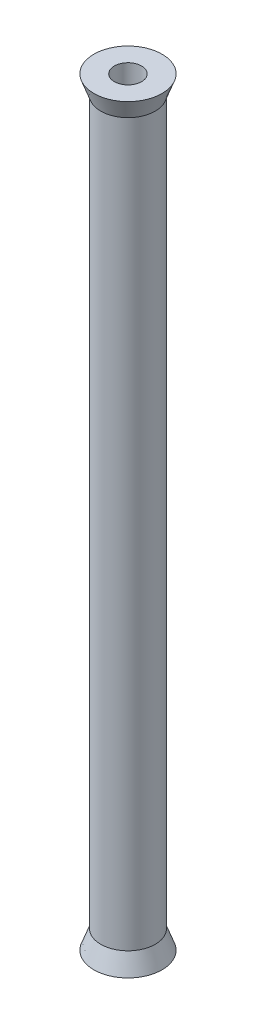
ISO-10303-21;
HEADER;
FILE_DESCRIPTION(('STEP AP214'),'2;1');
FILE_NAME('part.step','',(''),(''),'','','');
FILE_SCHEMA(('AUTOMOTIVE_DESIGN { 1 0 10303 214 1 1 1 1 }'));
ENDSEC;
DATA;
#1=APPLICATION_CONTEXT('core data for automotive mechanical design processes');
#2=APPLICATION_PROTOCOL_DEFINITION('international standard','automotive_design',2000,#1);
#3=PRODUCT_CONTEXT('',#1,'mechanical');
#4=PRODUCT('Part','Part','',(#3));
#5=PRODUCT_RELATED_PRODUCT_CATEGORY('part','',(#4));
#6=PRODUCT_DEFINITION_FORMATION('','',#4);
#7=PRODUCT_DEFINITION_CONTEXT('part definition',#1,'design');
#8=PRODUCT_DEFINITION('design','',#6,#7);
#9=PRODUCT_DEFINITION_SHAPE('','',#8);
#10=(LENGTH_UNIT() NAMED_UNIT(*) SI_UNIT(.MILLI.,.METRE.));
#11=(NAMED_UNIT(*) PLANE_ANGLE_UNIT() SI_UNIT($,.RADIAN.));
#12=(NAMED_UNIT(*) SI_UNIT($,.STERADIAN.) SOLID_ANGLE_UNIT());
#13=UNCERTAINTY_MEASURE_WITH_UNIT(LENGTH_MEASURE(1.E-05),#10,'distance_accuracy_value','');
#14=(GEOMETRIC_REPRESENTATION_CONTEXT(3) GLOBAL_UNCERTAINTY_ASSIGNED_CONTEXT((#13)) GLOBAL_UNIT_ASSIGNED_CONTEXT((#10,
#11,#12)) REPRESENTATION_CONTEXT('',''));
#15=CARTESIAN_POINT('',(0.,0.,0.));
#16=DIRECTION('',(0.,0.,1.));
#17=DIRECTION('',(1.,0.,0.));
#18=AXIS2_PLACEMENT_3D('',#15,#16,#17);
#19=CARTESIAN_POINT('',(0.,52.9525225805455,0.));
#20=DIRECTION('',(0.,1.,0.));
#21=DIRECTION('',(0.,0.,1.));
#22=AXIS2_PLACEMENT_3D('',#19,#20,#21);
#23=CONICAL_SURFACE('',#22,4.00000000000001,0.34906585039887);
#24=CARTESIAN_POINT('',(0.,55.7,0.));
#25=DIRECTION('',(0.,1.,0.));
#26=DIRECTION('',(0.,0.,1.));
#27=AXIS2_PLACEMENT_3D('',#24,#25,#26);
#28=CIRCLE('',#27,4.99999999999999);
#29=CARTESIAN_POINT('',(0.,55.7,4.99999999999999));
#30=VERTEX_POINT('',#29);
#31=EDGE_CURVE('E10',#30,#30,#28,.T.);
#32=ORIENTED_EDGE('',*,*,#31,.F.);
#33=EDGE_LOOP('',(#32));
#34=FACE_BOUND('',#33,.T.);
#35=CARTESIAN_POINT('',(0.,52.9525225805455,0.));
#36=DIRECTION('',(0.,1.,0.));
#37=DIRECTION('',(0.,0.,1.));
#38=AXIS2_PLACEMENT_3D('',#35,#36,#37);
#39=CIRCLE('',#38,4.00000000000001);
#40=CARTESIAN_POINT('',(0.,52.9525225805455,4.00000000000001));
#41=VERTEX_POINT('',#40);
#42=EDGE_CURVE('E61',#41,#41,#39,.T.);
#43=ORIENTED_EDGE('',*,*,#42,.T.);
#44=EDGE_LOOP('',(#43));
#45=FACE_BOUND('',#44,.T.);
#46=ADVANCED_FACE('F39',(#34,#45),#23,.T.);
#47=CARTESIAN_POINT('',(2.00000000000001,55.7,0.));
#48=DIRECTION('',(0.,-1.,0.));
#49=DIRECTION('',(0.,0.,-1.));
#50=AXIS2_PLACEMENT_3D('',#47,#48,#49);
#51=PLANE('',#50);
#52=CARTESIAN_POINT('',(0.,55.7,0.));
#53=DIRECTION('',(0.,1.,0.));
#54=DIRECTION('',(0.,0.,1.));
#55=AXIS2_PLACEMENT_3D('',#52,#53,#54);
#56=CIRCLE('',#55,2.00000000000001);
#57=CARTESIAN_POINT('',(0.,55.7,2.00000000000001));
#58=VERTEX_POINT('',#57);
#59=EDGE_CURVE('E45',#58,#58,#56,.T.);
#60=ORIENTED_EDGE('',*,*,#59,.F.);
#61=EDGE_LOOP('',(#60));
#62=FACE_BOUND('',#61,.T.);
#63=ORIENTED_EDGE('',*,*,#31,.T.);
#64=EDGE_LOOP('',(#63));
#65=FACE_BOUND('',#64,.T.);
#66=ADVANCED_FACE('F86',(#62,#65),#51,.F.);
#67=CARTESIAN_POINT('',(0.,0.,0.));
#68=DIRECTION('',(0.,1.,0.));
#69=DIRECTION('',(0.,0.,1.));
#70=AXIS2_PLACEMENT_3D('',#67,#68,#69);
#71=CYLINDRICAL_SURFACE('',#70,2.00000000000001);
#72=CARTESIAN_POINT('',(0.,-55.7,0.));
#73=DIRECTION('',(0.,1.,0.));
#74=DIRECTION('',(0.,0.,1.));
#75=AXIS2_PLACEMENT_3D('',#72,#73,#74);
#76=CIRCLE('',#75,2.00000000000001);
#77=CARTESIAN_POINT('',(0.,-55.7,2.00000000000001));
#78=VERTEX_POINT('',#77);
#79=EDGE_CURVE('E49',#78,#78,#76,.T.);
#80=ORIENTED_EDGE('',*,*,#79,.F.);
#81=EDGE_LOOP('',(#80));
#82=FACE_BOUND('',#81,.T.);
#83=ORIENTED_EDGE('',*,*,#59,.T.);
#84=EDGE_LOOP('',(#83));
#85=FACE_BOUND('',#84,.T.);
#86=ADVANCED_FACE('F81',(#82,#85),#71,.F.);
#87=CARTESIAN_POINT('',(2.00000000000001,-55.7,0.));
#88=DIRECTION('',(0.,1.,0.));
#89=DIRECTION('',(0.,0.,1.));
#90=AXIS2_PLACEMENT_3D('',#87,#88,#89);
#91=PLANE('',#90);
#92=CARTESIAN_POINT('',(0.,-55.7,0.));
#93=DIRECTION('',(0.,1.,0.));
#94=DIRECTION('',(0.,0.,1.));
#95=AXIS2_PLACEMENT_3D('',#92,#93,#94);
#96=CIRCLE('',#95,4.99999999999999);
#97=CARTESIAN_POINT('',(0.,-55.7,4.99999999999999));
#98=VERTEX_POINT('',#97);
#99=EDGE_CURVE('E53',#98,#98,#96,.T.);
#100=ORIENTED_EDGE('',*,*,#99,.F.);
#101=EDGE_LOOP('',(#100));
#102=FACE_BOUND('',#101,.T.);
#103=ORIENTED_EDGE('',*,*,#79,.T.);
#104=EDGE_LOOP('',(#103));
#105=FACE_BOUND('',#104,.T.);
#106=ADVANCED_FACE('F75',(#102,#105),#91,.F.);
#107=CARTESIAN_POINT('',(0.,-55.7,0.));
#108=DIRECTION('',(0.,-1.,0.));
#109=DIRECTION('',(0.,0.,-1.));
#110=AXIS2_PLACEMENT_3D('',#107,#108,#109);
#111=CONICAL_SURFACE('',#110,4.99999999999999,0.34906585039887);
#112=CARTESIAN_POINT('',(0.,-52.9525225805455,0.));
#113=DIRECTION('',(0.,1.,0.));
#114=DIRECTION('',(0.,0.,1.));
#115=AXIS2_PLACEMENT_3D('',#112,#113,#114);
#116=CIRCLE('',#115,4.00000000000001);
#117=CARTESIAN_POINT('',(0.,-52.9525225805455,4.00000000000001));
#118=VERTEX_POINT('',#117);
#119=EDGE_CURVE('E58',#118,#118,#116,.T.);
#120=ORIENTED_EDGE('',*,*,#119,.F.);
#121=EDGE_LOOP('',(#120));
#122=FACE_BOUND('',#121,.T.);
#123=ORIENTED_EDGE('',*,*,#99,.T.);
#124=EDGE_LOOP('',(#123));
#125=FACE_BOUND('',#124,.T.);
#126=ADVANCED_FACE('F69',(#122,#125),#111,.T.);
#127=CARTESIAN_POINT('',(0.,0.,0.));
#128=DIRECTION('',(0.,1.,0.));
#129=DIRECTION('',(0.,0.,1.));
#130=AXIS2_PLACEMENT_3D('',#127,#128,#129);
#131=CYLINDRICAL_SURFACE('',#130,4.00000000000001);
#132=ORIENTED_EDGE('',*,*,#42,.F.);
#133=EDGE_LOOP('',(#132));
#134=FACE_BOUND('',#133,.T.);
#135=ORIENTED_EDGE('',*,*,#119,.T.);
#136=EDGE_LOOP('',(#135));
#137=FACE_BOUND('',#136,.T.);
#138=ADVANCED_FACE('F66',(#134,#137),#131,.T.);
#139=CLOSED_SHELL('',(#46,#66,#86,#106,#126,#138));
#140=MANIFOLD_SOLID_BREP('B2',#139);
#141=ADVANCED_BREP_SHAPE_REPRESENTATION('',(#18,#140),#14);
#142=SHAPE_DEFINITION_REPRESENTATION(#9,#141);
ENDSEC;
END-ISO-10303-21;
